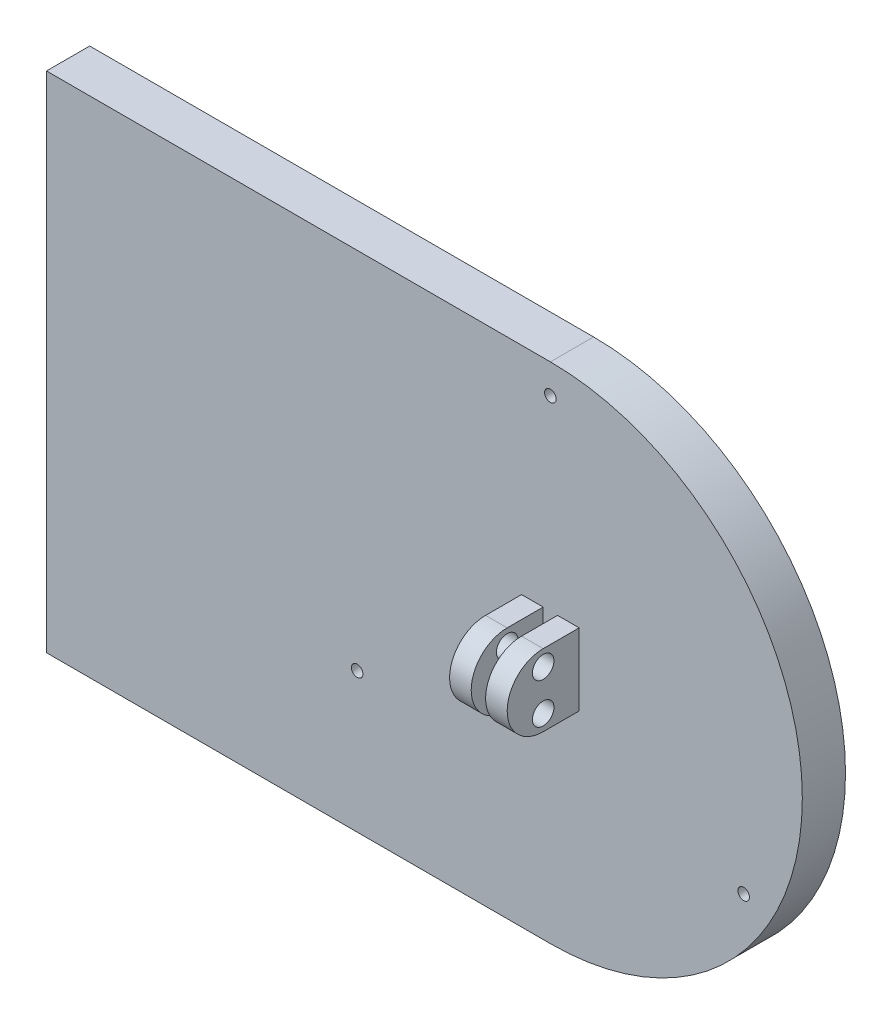
ISO-10303-21;
HEADER;
FILE_DESCRIPTION(('STEP AP214'),'2;1');
FILE_NAME('part.step','',(''),(''),'','','');
FILE_SCHEMA(('AUTOMOTIVE_DESIGN { 1 0 10303 214 1 1 1 1 }'));
ENDSEC;
DATA;
#1=APPLICATION_CONTEXT('core data for automotive mechanical design processes');
#2=APPLICATION_PROTOCOL_DEFINITION('international standard','automotive_design',2000,#1);
#3=PRODUCT_CONTEXT('',#1,'mechanical');
#4=PRODUCT('Part','Part','',(#3));
#5=PRODUCT_RELATED_PRODUCT_CATEGORY('part','',(#4));
#6=PRODUCT_DEFINITION_FORMATION('','',#4);
#7=PRODUCT_DEFINITION_CONTEXT('part definition',#1,'design');
#8=PRODUCT_DEFINITION('design','',#6,#7);
#9=PRODUCT_DEFINITION_SHAPE('','',#8);
#10=(LENGTH_UNIT() NAMED_UNIT(*) SI_UNIT(.MILLI.,.METRE.));
#11=(NAMED_UNIT(*) PLANE_ANGLE_UNIT() SI_UNIT($,.RADIAN.));
#12=(NAMED_UNIT(*) SI_UNIT($,.STERADIAN.) SOLID_ANGLE_UNIT());
#13=UNCERTAINTY_MEASURE_WITH_UNIT(LENGTH_MEASURE(1.E-05),#10,'distance_accuracy_value','');
#14=(GEOMETRIC_REPRESENTATION_CONTEXT(3) GLOBAL_UNCERTAINTY_ASSIGNED_CONTEXT((#13)) GLOBAL_UNIT_ASSIGNED_CONTEXT((#10,
#11,#12)) REPRESENTATION_CONTEXT('',''));
#15=CARTESIAN_POINT('',(0.,0.,0.));
#16=DIRECTION('',(0.,0.,1.));
#17=DIRECTION('',(1.,0.,0.));
#18=AXIS2_PLACEMENT_3D('',#15,#16,#17);
#19=CARTESIAN_POINT('',(0.999999999999999,5.,16.));
#20=DIRECTION('',(1.,0.,0.));
#21=DIRECTION('',(0.,1.,0.));
#22=AXIS2_PLACEMENT_3D('',#19,#20,#21);
#23=PLANE('',#22);
#24=CARTESIAN_POINT('',(1.,2.8,11.));
#25=DIRECTION('',(1.,0.,0.));
#26=DIRECTION('',(0.,1.,0.));
#27=AXIS2_PLACEMENT_3D('',#24,#25,#26);
#28=CIRCLE('',#27,1.5);
#29=CARTESIAN_POINT('',(1.,4.3,11.));
#30=VERTEX_POINT('',#29);
#31=EDGE_CURVE('E174',#30,#30,#28,.T.);
#32=ORIENTED_EDGE('',*,*,#31,.T.);
#33=EDGE_LOOP('',(#32));
#34=FACE_BOUND('',#33,.T.);
#35=CARTESIAN_POINT('',(1.,-2.8,11.));
#36=DIRECTION('',(1.,0.,0.));
#37=DIRECTION('',(0.,1.,0.));
#38=AXIS2_PLACEMENT_3D('',#35,#36,#37);
#39=CIRCLE('',#38,1.5);
#40=CARTESIAN_POINT('',(1.,-1.3,11.));
#41=VERTEX_POINT('',#40);
#42=EDGE_CURVE('E271',#41,#41,#39,.T.);
#43=ORIENTED_EDGE('',*,*,#42,.T.);
#44=EDGE_LOOP('',(#43));
#45=FACE_BOUND('',#44,.T.);
#46=DIRECTION('',(0.,0.,-1.));
#47=VECTOR('',#46,1.);
#48=CARTESIAN_POINT('',(1.,-5.,16.));
#49=LINE('',#48,#47);
#50=CARTESIAN_POINT('',(1.,-5.,11.));
#51=VERTEX_POINT('',#50);
#52=CARTESIAN_POINT('',(1.,-5.,6.));
#53=VERTEX_POINT('',#52);
#54=EDGE_CURVE('E181',#51,#53,#49,.T.);
#55=ORIENTED_EDGE('',*,*,#54,.F.);
#56=CARTESIAN_POINT('',(1.,0.,11.));
#57=DIRECTION('',(1.,0.,0.));
#58=DIRECTION('',(0.,1.,0.));
#59=AXIS2_PLACEMENT_3D('',#56,#57,#58);
#60=CIRCLE('',#59,5.);
#61=CARTESIAN_POINT('',(1.,5.,11.));
#62=VERTEX_POINT('',#61);
#63=EDGE_CURVE('E170',#51,#62,#60,.F.);
#64=ORIENTED_EDGE('',*,*,#63,.T.);
#65=DIRECTION('',(0.,0.,-1.));
#66=VECTOR('',#65,1.);
#67=CARTESIAN_POINT('',(0.999999999999999,5.,16.));
#68=LINE('',#67,#66);
#69=CARTESIAN_POINT('',(0.999999999999999,5.,6.));
#70=VERTEX_POINT('',#69);
#71=EDGE_CURVE('E187',#62,#70,#68,.T.);
#72=ORIENTED_EDGE('',*,*,#71,.T.);
#73=DIRECTION('',(0.,-1.,0.));
#74=VECTOR('',#73,1.);
#75=CARTESIAN_POINT('',(0.999999999999999,5.,6.));
#76=LINE('',#75,#74);
#77=EDGE_CURVE('E329',#70,#53,#76,.T.);
#78=ORIENTED_EDGE('',*,*,#77,.T.);
#79=EDGE_LOOP('',(#55,#64,#72,#78));
#80=FACE_BOUND('',#79,.T.);
#81=ADVANCED_FACE('F61',(#34,#45,#80),#23,.F.);
#82=CARTESIAN_POINT('',(4.,5.,16.));
#83=DIRECTION('',(-1.,0.,0.));
#84=DIRECTION('',(0.,-1.,0.));
#85=AXIS2_PLACEMENT_3D('',#82,#83,#84);
#86=PLANE('',#85);
#87=CARTESIAN_POINT('',(4.,2.8,11.));
#88=DIRECTION('',(1.,0.,0.));
#89=DIRECTION('',(0.,1.,0.));
#90=AXIS2_PLACEMENT_3D('',#87,#88,#89);
#91=CIRCLE('',#90,1.5);
#92=CARTESIAN_POINT('',(4.,4.3,11.));
#93=VERTEX_POINT('',#92);
#94=EDGE_CURVE('E265',#93,#93,#91,.T.);
#95=ORIENTED_EDGE('',*,*,#94,.F.);
#96=EDGE_LOOP('',(#95));
#97=FACE_BOUND('',#96,.T.);
#98=CARTESIAN_POINT('',(4.,-2.8,11.));
#99=DIRECTION('',(1.,0.,0.));
#100=DIRECTION('',(0.,1.,0.));
#101=AXIS2_PLACEMENT_3D('',#98,#99,#100);
#102=CIRCLE('',#101,1.5);
#103=CARTESIAN_POINT('',(4.,-1.3,11.));
#104=VERTEX_POINT('',#103);
#105=EDGE_CURVE('E274',#104,#104,#102,.T.);
#106=ORIENTED_EDGE('',*,*,#105,.F.);
#107=EDGE_LOOP('',(#106));
#108=FACE_BOUND('',#107,.T.);
#109=CARTESIAN_POINT('',(4.,0.,11.));
#110=DIRECTION('',(1.,0.,0.));
#111=DIRECTION('',(0.,1.,0.));
#112=AXIS2_PLACEMENT_3D('',#109,#110,#111);
#113=CIRCLE('',#112,5.);
#114=CARTESIAN_POINT('',(4.,-5.,11.));
#115=VERTEX_POINT('',#114);
#116=CARTESIAN_POINT('',(4.,5.,11.));
#117=VERTEX_POINT('',#116);
#118=EDGE_CURVE('E155',#115,#117,#113,.F.);
#119=ORIENTED_EDGE('',*,*,#118,.F.);
#120=DIRECTION('',(0.,0.,-1.));
#121=VECTOR('',#120,1.);
#122=CARTESIAN_POINT('',(4.,-5.,16.));
#123=LINE('',#122,#121);
#124=CARTESIAN_POINT('',(4.,-5.,6.));
#125=VERTEX_POINT('',#124);
#126=EDGE_CURVE('E159',#115,#125,#123,.T.);
#127=ORIENTED_EDGE('',*,*,#126,.T.);
#128=DIRECTION('',(0.,1.,0.));
#129=VECTOR('',#128,1.);
#130=CARTESIAN_POINT('',(4.,5.,6.));
#131=LINE('',#130,#129);
#132=CARTESIAN_POINT('',(4.,5.,6.));
#133=VERTEX_POINT('',#132);
#134=EDGE_CURVE('E335',#125,#133,#131,.T.);
#135=ORIENTED_EDGE('',*,*,#134,.T.);
#136=DIRECTION('',(0.,0.,-1.));
#137=VECTOR('',#136,1.);
#138=CARTESIAN_POINT('',(4.,5.,16.));
#139=LINE('',#138,#137);
#140=EDGE_CURVE('E87',#117,#133,#139,.T.);
#141=ORIENTED_EDGE('',*,*,#140,.F.);
#142=EDGE_LOOP('',(#119,#127,#135,#141));
#143=FACE_BOUND('',#142,.T.);
#144=ADVANCED_FACE('F157',(#97,#108,#143),#86,.F.);
#145=CARTESIAN_POINT('',(-1.,5.,16.));
#146=DIRECTION('',(-1.,0.,0.));
#147=DIRECTION('',(0.,-1.,0.));
#148=AXIS2_PLACEMENT_3D('',#145,#146,#147);
#149=PLANE('',#148);
#150=CARTESIAN_POINT('',(-1.,2.8,11.));
#151=DIRECTION('',(-1.,0.,0.));
#152=DIRECTION('',(0.,-1.,0.));
#153=AXIS2_PLACEMENT_3D('',#150,#151,#152);
#154=CIRCLE('',#153,1.5);
#155=CARTESIAN_POINT('',(-1.,1.3,11.));
#156=VERTEX_POINT('',#155);
#157=EDGE_CURVE('E285',#156,#156,#154,.T.);
#158=ORIENTED_EDGE('',*,*,#157,.T.);
#159=EDGE_LOOP('',(#158));
#160=FACE_BOUND('',#159,.T.);
#161=CARTESIAN_POINT('',(-1.,-2.8,11.));
#162=DIRECTION('',(-1.,0.,0.));
#163=DIRECTION('',(0.,-1.,0.));
#164=AXIS2_PLACEMENT_3D('',#161,#162,#163);
#165=CIRCLE('',#164,1.5);
#166=CARTESIAN_POINT('',(-1.,-4.3,11.));
#167=VERTEX_POINT('',#166);
#168=EDGE_CURVE('E264',#167,#167,#165,.T.);
#169=ORIENTED_EDGE('',*,*,#168,.T.);
#170=EDGE_LOOP('',(#169));
#171=FACE_BOUND('',#170,.T.);
#172=CARTESIAN_POINT('',(-1.,0.,11.));
#173=DIRECTION('',(-1.,0.,0.));
#174=DIRECTION('',(0.,-1.,0.));
#175=AXIS2_PLACEMENT_3D('',#172,#173,#174);
#176=CIRCLE('',#175,5.);
#177=CARTESIAN_POINT('',(-1.,5.,11.));
#178=VERTEX_POINT('',#177);
#179=CARTESIAN_POINT('',(-1.,-5.,11.));
#180=VERTEX_POINT('',#179);
#181=EDGE_CURVE('E299',#178,#180,#176,.F.);
#182=ORIENTED_EDGE('',*,*,#181,.T.);
#183=DIRECTION('',(0.,0.,-1.));
#184=VECTOR('',#183,1.);
#185=CARTESIAN_POINT('',(-0.999999999999999,-5.,16.));
#186=LINE('',#185,#184);
#187=CARTESIAN_POINT('',(-0.999999999999999,-5.,6.));
#188=VERTEX_POINT('',#187);
#189=EDGE_CURVE('E312',#180,#188,#186,.T.);
#190=ORIENTED_EDGE('',*,*,#189,.T.);
#191=DIRECTION('',(0.,1.,0.));
#192=VECTOR('',#191,1.);
#193=CARTESIAN_POINT('',(-1.,5.,6.));
#194=LINE('',#193,#192);
#195=CARTESIAN_POINT('',(-1.,5.,6.));
#196=VERTEX_POINT('',#195);
#197=EDGE_CURVE('E325',#188,#196,#194,.T.);
#198=ORIENTED_EDGE('',*,*,#197,.T.);
#199=DIRECTION('',(0.,0.,-1.));
#200=VECTOR('',#199,1.);
#201=CARTESIAN_POINT('',(-1.,5.,16.));
#202=LINE('',#201,#200);
#203=EDGE_CURVE('E304',#178,#196,#202,.T.);
#204=ORIENTED_EDGE('',*,*,#203,.F.);
#205=EDGE_LOOP('',(#182,#190,#198,#204));
#206=FACE_BOUND('',#205,.T.);
#207=ADVANCED_FACE('F362',(#160,#171,#206),#149,.F.);
#208=CARTESIAN_POINT('',(-4.,5.,16.));
#209=DIRECTION('',(1.,0.,0.));
#210=DIRECTION('',(0.,1.,0.));
#211=AXIS2_PLACEMENT_3D('',#208,#209,#210);
#212=PLANE('',#211);
#213=CARTESIAN_POINT('',(-4.,2.8,11.));
#214=DIRECTION('',(1.,0.,0.));
#215=DIRECTION('',(0.,1.,0.));
#216=AXIS2_PLACEMENT_3D('',#213,#214,#215);
#217=CIRCLE('',#216,1.5);
#218=CARTESIAN_POINT('',(-4.,4.3,11.));
#219=VERTEX_POINT('',#218);
#220=EDGE_CURVE('E65',#219,#219,#217,.T.);
#221=ORIENTED_EDGE('',*,*,#220,.T.);
#222=EDGE_LOOP('',(#221));
#223=FACE_BOUND('',#222,.T.);
#224=CARTESIAN_POINT('',(-4.,-2.8,11.));
#225=DIRECTION('',(1.,0.,0.));
#226=DIRECTION('',(0.,1.,0.));
#227=AXIS2_PLACEMENT_3D('',#224,#225,#226);
#228=CIRCLE('',#227,1.5);
#229=CARTESIAN_POINT('',(-4.,-1.3,11.));
#230=VERTEX_POINT('',#229);
#231=EDGE_CURVE('E261',#230,#230,#228,.T.);
#232=ORIENTED_EDGE('',*,*,#231,.T.);
#233=EDGE_LOOP('',(#232));
#234=FACE_BOUND('',#233,.T.);
#235=DIRECTION('',(0.,0.,-1.));
#236=VECTOR('',#235,1.);
#237=CARTESIAN_POINT('',(-4.,-5.,16.));
#238=LINE('',#237,#236);
#239=CARTESIAN_POINT('',(-4.,-5.,11.));
#240=VERTEX_POINT('',#239);
#241=CARTESIAN_POINT('',(-4.,-5.,6.));
#242=VERTEX_POINT('',#241);
#243=EDGE_CURVE('E79',#240,#242,#238,.T.);
#244=ORIENTED_EDGE('',*,*,#243,.F.);
#245=CARTESIAN_POINT('',(-4.,0.,11.));
#246=DIRECTION('',(1.,0.,0.));
#247=DIRECTION('',(0.,1.,0.));
#248=AXIS2_PLACEMENT_3D('',#245,#246,#247);
#249=CIRCLE('',#248,5.);
#250=CARTESIAN_POINT('',(-4.,5.,11.));
#251=VERTEX_POINT('',#250);
#252=EDGE_CURVE('E295',#240,#251,#249,.F.);
#253=ORIENTED_EDGE('',*,*,#252,.T.);
#254=DIRECTION('',(0.,0.,-1.));
#255=VECTOR('',#254,1.);
#256=CARTESIAN_POINT('',(-4.,5.,16.));
#257=LINE('',#256,#255);
#258=CARTESIAN_POINT('',(-4.,5.,6.));
#259=VERTEX_POINT('',#258);
#260=EDGE_CURVE('E307',#251,#259,#257,.T.);
#261=ORIENTED_EDGE('',*,*,#260,.T.);
#262=DIRECTION('',(0.,-1.,0.));
#263=VECTOR('',#262,1.);
#264=CARTESIAN_POINT('',(-4.,5.,6.));
#265=LINE('',#264,#263);
#266=EDGE_CURVE('E318',#259,#242,#265,.T.);
#267=ORIENTED_EDGE('',*,*,#266,.T.);
#268=EDGE_LOOP('',(#244,#253,#261,#267));
#269=FACE_BOUND('',#268,.T.);
#270=ADVANCED_FACE('F470',(#223,#234,#269),#212,.F.);
#271=CARTESIAN_POINT('',(0.999999999999999,5.,16.));
#272=DIRECTION('',(0.,-1.,0.));
#273=DIRECTION('',(0.,0.,-1.));
#274=AXIS2_PLACEMENT_3D('',#271,#272,#273);
#275=PLANE('',#274);
#276=DIRECTION('',(1.,0.,0.));
#277=VECTOR('',#276,1.);
#278=CARTESIAN_POINT('',(-70.,4.99999999999999,11.));
#279=LINE('',#278,#277);
#280=EDGE_CURVE('E163',#62,#117,#279,.T.);
#281=ORIENTED_EDGE('',*,*,#280,.T.);
#282=ORIENTED_EDGE('',*,*,#140,.T.);
#283=DIRECTION('',(-1.,0.,0.));
#284=VECTOR('',#283,1.);
#285=CARTESIAN_POINT('',(0.999999999999999,5.,6.));
#286=LINE('',#285,#284);
#287=EDGE_CURVE('E338',#133,#70,#286,.T.);
#288=ORIENTED_EDGE('',*,*,#287,.T.);
#289=ORIENTED_EDGE('',*,*,#71,.F.);
#290=EDGE_LOOP('',(#281,#282,#288,#289));
#291=FACE_BOUND('',#290,.T.);
#292=ADVANCED_FACE('F345',(#291),#275,.F.);
#293=CARTESIAN_POINT('',(-1.,5.,16.));
#294=DIRECTION('',(0.,-1.,0.));
#295=DIRECTION('',(0.,0.,-1.));
#296=AXIS2_PLACEMENT_3D('',#293,#294,#295);
#297=PLANE('',#296);
#298=EDGE_CURVE('E294',#251,#178,#279,.T.);
#299=ORIENTED_EDGE('',*,*,#298,.T.);
#300=ORIENTED_EDGE('',*,*,#203,.T.);
#301=DIRECTION('',(-1.,0.,0.));
#302=VECTOR('',#301,1.);
#303=CARTESIAN_POINT('',(-1.,5.,6.));
#304=LINE('',#303,#302);
#305=EDGE_CURVE('E321',#196,#259,#304,.T.);
#306=ORIENTED_EDGE('',*,*,#305,.T.);
#307=ORIENTED_EDGE('',*,*,#260,.F.);
#308=EDGE_LOOP('',(#299,#300,#306,#307));
#309=FACE_BOUND('',#308,.T.);
#310=ADVANCED_FACE('F350',(#309),#297,.F.);
#311=CARTESIAN_POINT('',(0.,0.,6.));
#312=DIRECTION('',(0.,0.,1.));
#313=DIRECTION('',(1.,0.,0.));
#314=AXIS2_PLACEMENT_3D('',#311,#312,#313);
#315=PLANE('',#314);
#316=CARTESIAN_POINT('',(0.,0.,6.));
#317=DIRECTION('',(0.,0.,1.));
#318=DIRECTION('',(1.,0.,0.));
#319=AXIS2_PLACEMENT_3D('',#316,#317,#318);
#320=CIRCLE('',#319,0.6);
#321=CARTESIAN_POINT('',(0.6,0.,6.));
#322=VERTEX_POINT('',#321);
#323=EDGE_CURVE('E185',#322,#322,#320,.T.);
#324=ORIENTED_EDGE('',*,*,#323,.F.);
#325=EDGE_LOOP('',(#324));
#326=FACE_BOUND('',#325,.T.);
#327=CARTESIAN_POINT('',(1.34704405012329E-12,30.9142781849874,6.));
#328=DIRECTION('',(0.,0.,1.));
#329=DIRECTION('',(1.,0.,0.));
#330=AXIS2_PLACEMENT_3D('',#327,#328,#329);
#331=CIRCLE('',#330,0.799999999999999);
#332=CARTESIAN_POINT('',(0.800000000001346,30.9142781849874,6.));
#333=VERTEX_POINT('',#332);
#334=EDGE_CURVE('E204',#333,#333,#331,.T.);
#335=ORIENTED_EDGE('',*,*,#334,.F.);
#336=EDGE_LOOP('',(#335));
#337=FACE_BOUND('',#336,.T.);
#338=CARTESIAN_POINT('',(26.8467875173189,-15.5857218150126,6.));
#339=DIRECTION('',(0.,0.,1.));
#340=DIRECTION('',(1.,0.,0.));
#341=AXIS2_PLACEMENT_3D('',#338,#339,#340);
#342=CIRCLE('',#341,0.799999999999999);
#343=CARTESIAN_POINT('',(27.6467875173189,-15.5857218150126,6.));
#344=VERTEX_POINT('',#343);
#345=EDGE_CURVE('E208',#344,#344,#342,.T.);
#346=ORIENTED_EDGE('',*,*,#345,.F.);
#347=EDGE_LOOP('',(#346));
#348=FACE_BOUND('',#347,.T.);
#349=CARTESIAN_POINT('',(-26.8467875173163,-15.5857218150126,6.));
#350=DIRECTION('',(0.,0.,1.));
#351=DIRECTION('',(1.,0.,0.));
#352=AXIS2_PLACEMENT_3D('',#349,#350,#351);
#353=CIRCLE('',#352,0.799999999999999);
#354=CARTESIAN_POINT('',(-26.0467875173163,-15.5857218150126,6.));
#355=VERTEX_POINT('',#354);
#356=EDGE_CURVE('E216',#355,#355,#353,.T.);
#357=ORIENTED_EDGE('',*,*,#356,.F.);
#358=EDGE_LOOP('',(#357));
#359=FACE_BOUND('',#358,.T.);
#360=CARTESIAN_POINT('',(0.,0.,6.));
#361=DIRECTION('',(0.,0.,1.));
#362=DIRECTION('',(1.,0.,0.));
#363=AXIS2_PLACEMENT_3D('',#360,#361,#362);
#364=CIRCLE('',#363,35.);
#365=CARTESIAN_POINT('',(0.,-35.,6.));
#366=VERTEX_POINT('',#365);
#367=CARTESIAN_POINT('',(0.,35.,6.));
#368=VERTEX_POINT('',#367);
#369=EDGE_CURVE('E12',#366,#368,#364,.T.);
#370=ORIENTED_EDGE('',*,*,#369,.T.);
#371=DIRECTION('',(1.,0.,0.));
#372=VECTOR('',#371,1.);
#373=CARTESIAN_POINT('',(0.,35.,6.));
#374=LINE('',#373,#372);
#375=CARTESIAN_POINT('',(-70.,35.,6.));
#376=VERTEX_POINT('',#375);
#377=EDGE_CURVE('E223',#376,#368,#374,.T.);
#378=ORIENTED_EDGE('',*,*,#377,.F.);
#379=DIRECTION('',(0.,1.,0.));
#380=VECTOR('',#379,1.);
#381=CARTESIAN_POINT('',(-70.,35.,6.));
#382=LINE('',#381,#380);
#383=CARTESIAN_POINT('',(-70.,-35.,6.));
#384=VERTEX_POINT('',#383);
#385=EDGE_CURVE('E232',#384,#376,#382,.T.);
#386=ORIENTED_EDGE('',*,*,#385,.F.);
#387=DIRECTION('',(-1.,0.,0.));
#388=VECTOR('',#387,1.);
#389=CARTESIAN_POINT('',(0.,-35.,6.));
#390=LINE('',#389,#388);
#391=EDGE_CURVE('E227',#366,#384,#390,.T.);
#392=ORIENTED_EDGE('',*,*,#391,.F.);
#393=EDGE_LOOP('',(#370,#378,#386,#392));
#394=FACE_BOUND('',#393,.T.);
#395=DIRECTION('',(1.,0.,0.));
#396=VECTOR('',#395,1.);
#397=CARTESIAN_POINT('',(1.,-5.,6.));
#398=LINE('',#397,#396);
#399=EDGE_CURVE('E178',#53,#125,#398,.T.);
#400=ORIENTED_EDGE('',*,*,#399,.F.);
#401=ORIENTED_EDGE('',*,*,#77,.F.);
#402=ORIENTED_EDGE('',*,*,#287,.F.);
#403=ORIENTED_EDGE('',*,*,#134,.F.);
#404=EDGE_LOOP('',(#400,#401,#402,#403));
#405=FACE_BOUND('',#404,.T.);
#406=ORIENTED_EDGE('',*,*,#305,.F.);
#407=ORIENTED_EDGE('',*,*,#197,.F.);
#408=DIRECTION('',(1.,0.,0.));
#409=VECTOR('',#408,1.);
#410=CARTESIAN_POINT('',(-0.999999999999999,-5.,6.));
#411=LINE('',#410,#409);
#412=EDGE_CURVE('E315',#242,#188,#411,.T.);
#413=ORIENTED_EDGE('',*,*,#412,.F.);
#414=ORIENTED_EDGE('',*,*,#266,.F.);
#415=EDGE_LOOP('',(#406,#407,#413,#414));
#416=FACE_BOUND('',#415,.T.);
#417=ADVANCED_FACE('F347',(#326,#337,#348,#359,#394,#405,#416),#315,.T.);
#418=CARTESIAN_POINT('',(0.,0.,6.));
#419=DIRECTION('',(0.,0.,-1.));
#420=DIRECTION('',(-1.,0.,0.));
#421=AXIS2_PLACEMENT_3D('',#418,#419,#420);
#422=CYLINDRICAL_SURFACE('',#421,35.);
#423=ORIENTED_EDGE('',*,*,#369,.F.);
#424=DIRECTION('',(0.,0.,-1.));
#425=VECTOR('',#424,1.);
#426=CARTESIAN_POINT('',(0.,-35.,6.));
#427=LINE('',#426,#425);
#428=CARTESIAN_POINT('',(0.,-35.,0.));
#429=VERTEX_POINT('',#428);
#430=EDGE_CURVE('E253',#366,#429,#427,.T.);
#431=ORIENTED_EDGE('',*,*,#430,.T.);
#432=CARTESIAN_POINT('',(0.,0.,0.));
#433=DIRECTION('',(0.,0.,1.));
#434=DIRECTION('',(1.,0.,0.));
#435=AXIS2_PLACEMENT_3D('',#432,#433,#434);
#436=CIRCLE('',#435,35.);
#437=CARTESIAN_POINT('',(0.,35.,0.));
#438=VERTEX_POINT('',#437);
#439=EDGE_CURVE('E71',#429,#438,#436,.T.);
#440=ORIENTED_EDGE('',*,*,#439,.T.);
#441=DIRECTION('',(0.,0.,-1.));
#442=VECTOR('',#441,1.);
#443=CARTESIAN_POINT('',(0.,35.,6.));
#444=LINE('',#443,#442);
#445=EDGE_CURVE('E236',#368,#438,#444,.T.);
#446=ORIENTED_EDGE('',*,*,#445,.F.);
#447=EDGE_LOOP('',(#423,#431,#440,#446));
#448=FACE_BOUND('',#447,.T.);
#449=ADVANCED_FACE('F63',(#448),#422,.T.);
#450=CARTESIAN_POINT('',(0.,0.,0.));
#451=DIRECTION('',(0.,0.,1.));
#452=DIRECTION('',(1.,0.,0.));
#453=AXIS2_PLACEMENT_3D('',#450,#451,#452);
#454=PLANE('',#453);
#455=CARTESIAN_POINT('',(0.,0.,0.));
#456=DIRECTION('',(0.,0.,1.));
#457=DIRECTION('',(1.,0.,0.));
#458=AXIS2_PLACEMENT_3D('',#455,#456,#457);
#459=CIRCLE('',#458,0.6);
#460=CARTESIAN_POINT('',(0.6,0.,0.));
#461=VERTEX_POINT('',#460);
#462=EDGE_CURVE('E191',#461,#461,#459,.T.);
#463=ORIENTED_EDGE('',*,*,#462,.T.);
#464=EDGE_LOOP('',(#463));
#465=FACE_BOUND('',#464,.T.);
#466=CARTESIAN_POINT('',(1.34704405012329E-12,30.9142781849874,0.));
#467=DIRECTION('',(0.,0.,1.));
#468=DIRECTION('',(1.,0.,0.));
#469=AXIS2_PLACEMENT_3D('',#466,#467,#468);
#470=CIRCLE('',#469,0.799999999999999);
#471=CARTESIAN_POINT('',(0.800000000001346,30.9142781849874,0.));
#472=VERTEX_POINT('',#471);
#473=EDGE_CURVE('E199',#472,#472,#470,.T.);
#474=ORIENTED_EDGE('',*,*,#473,.T.);
#475=EDGE_LOOP('',(#474));
#476=FACE_BOUND('',#475,.T.);
#477=CARTESIAN_POINT('',(26.8467875173189,-15.5857218150126,0.));
#478=DIRECTION('',(0.,0.,1.));
#479=DIRECTION('',(1.,0.,0.));
#480=AXIS2_PLACEMENT_3D('',#477,#478,#479);
#481=CIRCLE('',#480,0.799999999999999);
#482=CARTESIAN_POINT('',(27.6467875173189,-15.5857218150126,0.));
#483=VERTEX_POINT('',#482);
#484=EDGE_CURVE('E212',#483,#483,#481,.T.);
#485=ORIENTED_EDGE('',*,*,#484,.T.);
#486=EDGE_LOOP('',(#485));
#487=FACE_BOUND('',#486,.T.);
#488=CARTESIAN_POINT('',(-26.8467875173163,-15.5857218150126,0.));
#489=DIRECTION('',(0.,0.,1.));
#490=DIRECTION('',(1.,0.,0.));
#491=AXIS2_PLACEMENT_3D('',#488,#489,#490);
#492=CIRCLE('',#491,0.799999999999999);
#493=CARTESIAN_POINT('',(-26.0467875173163,-15.5857218150126,0.));
#494=VERTEX_POINT('',#493);
#495=EDGE_CURVE('E195',#494,#494,#492,.T.);
#496=ORIENTED_EDGE('',*,*,#495,.T.);
#497=EDGE_LOOP('',(#496));
#498=FACE_BOUND('',#497,.T.);
#499=ORIENTED_EDGE('',*,*,#439,.F.);
#500=DIRECTION('',(-1.,0.,0.));
#501=VECTOR('',#500,1.);
#502=CARTESIAN_POINT('',(0.,-35.,0.));
#503=LINE('',#502,#501);
#504=CARTESIAN_POINT('',(-70.,-35.,0.));
#505=VERTEX_POINT('',#504);
#506=EDGE_CURVE('E240',#429,#505,#503,.T.);
#507=ORIENTED_EDGE('',*,*,#506,.T.);
#508=DIRECTION('',(0.,1.,0.));
#509=VECTOR('',#508,1.);
#510=CARTESIAN_POINT('',(-70.,35.,0.));
#511=LINE('',#510,#509);
#512=CARTESIAN_POINT('',(-70.,35.,0.));
#513=VERTEX_POINT('',#512);
#514=EDGE_CURVE('E228',#505,#513,#511,.T.);
#515=ORIENTED_EDGE('',*,*,#514,.T.);
#516=DIRECTION('',(1.,0.,0.));
#517=VECTOR('',#516,1.);
#518=CARTESIAN_POINT('',(0.,35.,0.));
#519=LINE('',#518,#517);
#520=EDGE_CURVE('E203',#513,#438,#519,.T.);
#521=ORIENTED_EDGE('',*,*,#520,.T.);
#522=EDGE_LOOP('',(#499,#507,#515,#521));
#523=FACE_BOUND('',#522,.T.);
#524=ADVANCED_FACE('F414',(#465,#476,#487,#498,#523),#454,.F.);
#525=CARTESIAN_POINT('',(0.,35.,6.));
#526=DIRECTION('',(0.,1.,0.));
#527=DIRECTION('',(-1.,0.,0.));
#528=AXIS2_PLACEMENT_3D('',#525,#526,#527);
#529=PLANE('',#528);
#530=ORIENTED_EDGE('',*,*,#520,.F.);
#531=DIRECTION('',(0.,0.,-1.));
#532=VECTOR('',#531,1.);
#533=CARTESIAN_POINT('',(-70.,35.,6.));
#534=LINE('',#533,#532);
#535=EDGE_CURVE('E247',#376,#513,#534,.T.);
#536=ORIENTED_EDGE('',*,*,#535,.F.);
#537=ORIENTED_EDGE('',*,*,#377,.T.);
#538=ORIENTED_EDGE('',*,*,#445,.T.);
#539=EDGE_LOOP('',(#530,#536,#537,#538));
#540=FACE_BOUND('',#539,.T.);
#541=ADVANCED_FACE('F408',(#540),#529,.T.);
#542=CARTESIAN_POINT('',(-70.,35.,6.));
#543=DIRECTION('',(-1.,0.,0.));
#544=DIRECTION('',(0.,0.,1.));
#545=AXIS2_PLACEMENT_3D('',#542,#543,#544);
#546=PLANE('',#545);
#547=ORIENTED_EDGE('',*,*,#514,.F.);
#548=DIRECTION('',(0.,0.,-1.));
#549=VECTOR('',#548,1.);
#550=CARTESIAN_POINT('',(-70.,-35.,6.));
#551=LINE('',#550,#549);
#552=EDGE_CURVE('E250',#384,#505,#551,.T.);
#553=ORIENTED_EDGE('',*,*,#552,.F.);
#554=ORIENTED_EDGE('',*,*,#385,.T.);
#555=ORIENTED_EDGE('',*,*,#535,.T.);
#556=EDGE_LOOP('',(#547,#553,#554,#555));
#557=FACE_BOUND('',#556,.T.);
#558=ADVANCED_FACE('F405',(#557),#546,.T.);
#559=CARTESIAN_POINT('',(0.,-35.,6.));
#560=DIRECTION('',(0.,-1.,0.));
#561=DIRECTION('',(1.,0.,0.));
#562=AXIS2_PLACEMENT_3D('',#559,#560,#561);
#563=PLANE('',#562);
#564=ORIENTED_EDGE('',*,*,#506,.F.);
#565=ORIENTED_EDGE('',*,*,#430,.F.);
#566=ORIENTED_EDGE('',*,*,#391,.T.);
#567=ORIENTED_EDGE('',*,*,#552,.T.);
#568=EDGE_LOOP('',(#564,#565,#566,#567));
#569=FACE_BOUND('',#568,.T.);
#570=ADVANCED_FACE('F403',(#569),#563,.T.);
#571=CARTESIAN_POINT('',(-26.8467875173163,-15.5857218150126,0.));
#572=DIRECTION('',(0.,0.,1.));
#573=DIRECTION('',(1.,0.,0.));
#574=AXIS2_PLACEMENT_3D('',#571,#572,#573);
#575=CYLINDRICAL_SURFACE('',#574,0.799999999999999);
#576=ORIENTED_EDGE('',*,*,#495,.F.);
#577=EDGE_LOOP('',(#576));
#578=FACE_BOUND('',#577,.T.);
#579=ORIENTED_EDGE('',*,*,#356,.T.);
#580=EDGE_LOOP('',(#579));
#581=FACE_BOUND('',#580,.T.);
#582=ADVANCED_FACE('F399',(#578,#581),#575,.F.);
#583=CARTESIAN_POINT('',(26.8467875173189,-15.5857218150126,0.));
#584=DIRECTION('',(0.,0.,1.));
#585=DIRECTION('',(1.,0.,0.));
#586=AXIS2_PLACEMENT_3D('',#583,#584,#585);
#587=CYLINDRICAL_SURFACE('',#586,0.799999999999999);
#588=ORIENTED_EDGE('',*,*,#484,.F.);
#589=EDGE_LOOP('',(#588));
#590=FACE_BOUND('',#589,.T.);
#591=ORIENTED_EDGE('',*,*,#345,.T.);
#592=EDGE_LOOP('',(#591));
#593=FACE_BOUND('',#592,.T.);
#594=ADVANCED_FACE('F395',(#590,#593),#587,.F.);
#595=CARTESIAN_POINT('',(1.34704405012329E-12,30.9142781849874,0.));
#596=DIRECTION('',(0.,0.,1.));
#597=DIRECTION('',(1.,0.,0.));
#598=AXIS2_PLACEMENT_3D('',#595,#596,#597);
#599=CYLINDRICAL_SURFACE('',#598,0.799999999999999);
#600=ORIENTED_EDGE('',*,*,#473,.F.);
#601=EDGE_LOOP('',(#600));
#602=FACE_BOUND('',#601,.T.);
#603=ORIENTED_EDGE('',*,*,#334,.T.);
#604=EDGE_LOOP('',(#603));
#605=FACE_BOUND('',#604,.T.);
#606=ADVANCED_FACE('F391',(#602,#605),#599,.F.);
#607=CARTESIAN_POINT('',(0.,0.,0.));
#608=DIRECTION('',(0.,0.,1.));
#609=DIRECTION('',(1.,0.,0.));
#610=AXIS2_PLACEMENT_3D('',#607,#608,#609);
#611=CYLINDRICAL_SURFACE('',#610,0.6);
#612=ORIENTED_EDGE('',*,*,#462,.F.);
#613=EDGE_LOOP('',(#612));
#614=FACE_BOUND('',#613,.T.);
#615=ORIENTED_EDGE('',*,*,#323,.T.);
#616=EDGE_LOOP('',(#615));
#617=FACE_BOUND('',#616,.T.);
#618=ADVANCED_FACE('F375',(#614,#617),#611,.F.);
#619=CARTESIAN_POINT('',(1.,-5.,16.));
#620=DIRECTION('',(0.,1.,0.));
#621=DIRECTION('',(-1.,0.,0.));
#622=AXIS2_PLACEMENT_3D('',#619,#620,#621);
#623=PLANE('',#622);
#624=ORIENTED_EDGE('',*,*,#126,.F.);
#625=DIRECTION('',(1.,0.,0.));
#626=VECTOR('',#625,1.);
#627=CARTESIAN_POINT('',(-70.,-5.00000000000001,11.));
#628=LINE('',#627,#626);
#629=EDGE_CURVE('E167',#51,#115,#628,.T.);
#630=ORIENTED_EDGE('',*,*,#629,.F.);
#631=ORIENTED_EDGE('',*,*,#54,.T.);
#632=ORIENTED_EDGE('',*,*,#399,.T.);
#633=EDGE_LOOP('',(#624,#630,#631,#632));
#634=FACE_BOUND('',#633,.T.);
#635=ADVANCED_FACE('F176',(#634),#623,.F.);
#636=CARTESIAN_POINT('',(-0.999999999999999,-5.,16.));
#637=DIRECTION('',(0.,1.,0.));
#638=DIRECTION('',(0.,0.,1.));
#639=AXIS2_PLACEMENT_3D('',#636,#637,#638);
#640=PLANE('',#639);
#641=ORIENTED_EDGE('',*,*,#189,.F.);
#642=EDGE_CURVE('E164',#240,#180,#628,.T.);
#643=ORIENTED_EDGE('',*,*,#642,.F.);
#644=ORIENTED_EDGE('',*,*,#243,.T.);
#645=ORIENTED_EDGE('',*,*,#412,.T.);
#646=EDGE_LOOP('',(#641,#643,#644,#645));
#647=FACE_BOUND('',#646,.T.);
#648=ADVANCED_FACE('F365',(#647),#640,.F.);
#649=CARTESIAN_POINT('',(-70.,0.,11.));
#650=DIRECTION('',(1.,0.,0.));
#651=DIRECTION('',(0.,1.,0.));
#652=AXIS2_PLACEMENT_3D('',#649,#650,#651);
#653=CYLINDRICAL_SURFACE('',#652,5.);
#654=ORIENTED_EDGE('',*,*,#298,.F.);
#655=ORIENTED_EDGE('',*,*,#252,.F.);
#656=ORIENTED_EDGE('',*,*,#642,.T.);
#657=ORIENTED_EDGE('',*,*,#181,.F.);
#658=EDGE_LOOP('',(#654,#655,#656,#657));
#659=FACE_BOUND('',#658,.T.);
#660=ADVANCED_FACE('F367',(#659),#653,.T.);
#661=ORIENTED_EDGE('',*,*,#63,.F.);
#662=ORIENTED_EDGE('',*,*,#629,.T.);
#663=ORIENTED_EDGE('',*,*,#118,.T.);
#664=ORIENTED_EDGE('',*,*,#280,.F.);
#665=EDGE_LOOP('',(#661,#662,#663,#664));
#666=FACE_BOUND('',#665,.T.);
#667=ADVANCED_FACE('F168',(#666),#653,.T.);
#668=CARTESIAN_POINT('',(-70.,-2.80000000000001,11.));
#669=DIRECTION('',(1.,0.,0.));
#670=DIRECTION('',(0.,1.,0.));
#671=AXIS2_PLACEMENT_3D('',#668,#669,#670);
#672=CYLINDRICAL_SURFACE('',#671,1.5);
#673=ORIENTED_EDGE('',*,*,#231,.F.);
#674=EDGE_LOOP('',(#673));
#675=FACE_BOUND('',#674,.T.);
#676=ORIENTED_EDGE('',*,*,#168,.F.);
#677=EDGE_LOOP('',(#676));
#678=FACE_BOUND('',#677,.T.);
#679=ADVANCED_FACE('F504',(#675,#678),#672,.F.);
#680=CARTESIAN_POINT('',(-70.,2.79999999999999,11.));
#681=DIRECTION('',(1.,0.,0.));
#682=DIRECTION('',(0.,1.,0.));
#683=AXIS2_PLACEMENT_3D('',#680,#681,#682);
#684=CYLINDRICAL_SURFACE('',#683,1.5);
#685=ORIENTED_EDGE('',*,*,#220,.F.);
#686=EDGE_LOOP('',(#685));
#687=FACE_BOUND('',#686,.T.);
#688=ORIENTED_EDGE('',*,*,#157,.F.);
#689=EDGE_LOOP('',(#688));
#690=FACE_BOUND('',#689,.T.);
#691=ADVANCED_FACE('F624',(#687,#690),#684,.F.);
#692=ORIENTED_EDGE('',*,*,#105,.T.);
#693=EDGE_LOOP('',(#692));
#694=FACE_BOUND('',#693,.T.);
#695=ORIENTED_EDGE('',*,*,#42,.F.);
#696=EDGE_LOOP('',(#695));
#697=FACE_BOUND('',#696,.T.);
#698=ADVANCED_FACE('F627',(#694,#697),#672,.F.);
#699=ORIENTED_EDGE('',*,*,#94,.T.);
#700=EDGE_LOOP('',(#699));
#701=FACE_BOUND('',#700,.T.);
#702=ORIENTED_EDGE('',*,*,#31,.F.);
#703=EDGE_LOOP('',(#702));
#704=FACE_BOUND('',#703,.T.);
#705=ADVANCED_FACE('F636',(#701,#704),#684,.F.);
#706=CLOSED_SHELL('',(#81,#144,#207,#270,#292,#310,#417,#449,#524,#541,#558,#570,#582,#594,#606,
#618,#635,#648,#660,#667,#679,#691,#698,#705));
#707=MANIFOLD_SOLID_BREP('B2',#706);
#708=ADVANCED_BREP_SHAPE_REPRESENTATION('',(#18,#707),#14);
#709=SHAPE_DEFINITION_REPRESENTATION(#9,#708);
ENDSEC;
END-ISO-10303-21;
